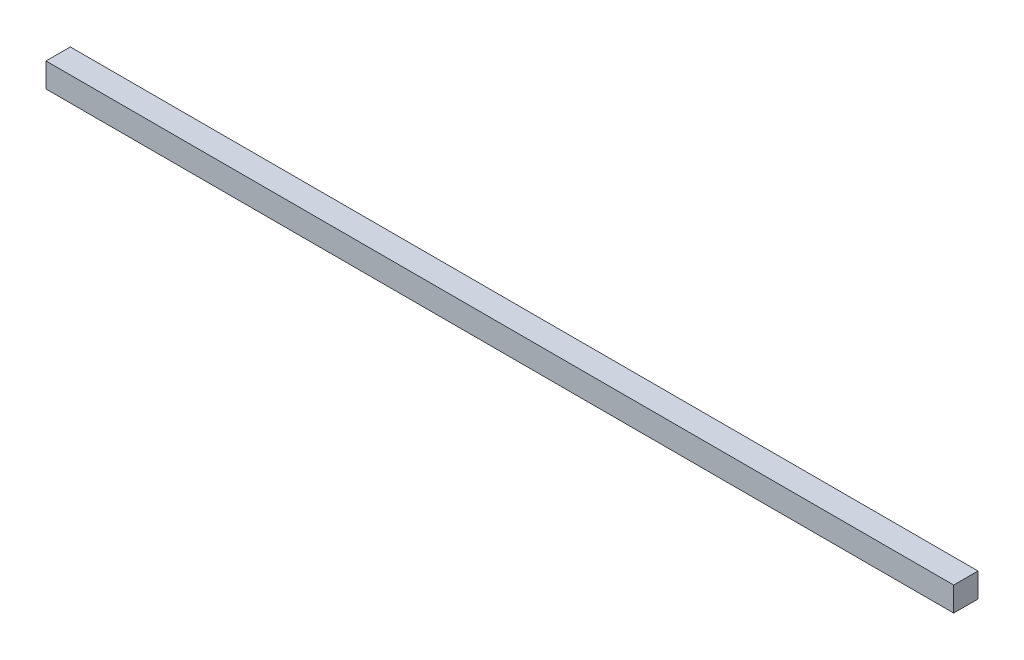
ISO-10303-21;
HEADER;
FILE_DESCRIPTION(('STEP AP214'),'2;1');
FILE_NAME('part.step','',(''),(''),'','','');
FILE_SCHEMA(('AUTOMOTIVE_DESIGN { 1 0 10303 214 1 1 1 1 }'));
ENDSEC;
DATA;
#1=APPLICATION_CONTEXT('core data for automotive mechanical design processes');
#2=APPLICATION_PROTOCOL_DEFINITION('international standard','automotive_design',2000,#1);
#3=PRODUCT_CONTEXT('',#1,'mechanical');
#4=PRODUCT('Part','Part','',(#3));
#5=PRODUCT_RELATED_PRODUCT_CATEGORY('part','',(#4));
#6=PRODUCT_DEFINITION_FORMATION('','',#4);
#7=PRODUCT_DEFINITION_CONTEXT('part definition',#1,'design');
#8=PRODUCT_DEFINITION('design','',#6,#7);
#9=PRODUCT_DEFINITION_SHAPE('','',#8);
#10=(LENGTH_UNIT() NAMED_UNIT(*) SI_UNIT(.MILLI.,.METRE.));
#11=(NAMED_UNIT(*) PLANE_ANGLE_UNIT() SI_UNIT($,.RADIAN.));
#12=(NAMED_UNIT(*) SI_UNIT($,.STERADIAN.) SOLID_ANGLE_UNIT());
#13=UNCERTAINTY_MEASURE_WITH_UNIT(LENGTH_MEASURE(1.E-05),#10,'distance_accuracy_value','');
#14=(GEOMETRIC_REPRESENTATION_CONTEXT(3) GLOBAL_UNCERTAINTY_ASSIGNED_CONTEXT((#13)) GLOBAL_UNIT_ASSIGNED_CONTEXT((#10,
#11,#12)) REPRESENTATION_CONTEXT('',''));
#15=CARTESIAN_POINT('',(0.,0.,0.));
#16=DIRECTION('',(0.,0.,1.));
#17=DIRECTION('',(1.,0.,0.));
#18=AXIS2_PLACEMENT_3D('',#15,#16,#17);
#19=CARTESIAN_POINT('',(1422.4,0.,0.));
#20=DIRECTION('',(0.,0.,-1.));
#21=DIRECTION('',(0.,1.,0.));
#22=AXIS2_PLACEMENT_3D('',#19,#20,#21);
#23=PLANE('',#22);
#24=DIRECTION('',(0.,-1.,0.));
#25=VECTOR('',#24,1.);
#26=CARTESIAN_POINT('',(0.,0.,0.));
#27=LINE('',#26,#25);
#28=CARTESIAN_POINT('',(0.,0.,0.));
#29=VERTEX_POINT('',#28);
#30=CARTESIAN_POINT('',(0.,-38.1,0.));
#31=VERTEX_POINT('',#30);
#32=EDGE_CURVE('E111',#29,#31,#27,.T.);
#33=ORIENTED_EDGE('',*,*,#32,.T.);
#34=DIRECTION('',(-1.,0.,0.));
#35=VECTOR('',#34,1.);
#36=CARTESIAN_POINT('',(1422.4,-38.1,0.));
#37=LINE('',#36,#35);
#38=CARTESIAN_POINT('',(1422.4,-38.1,0.));
#39=VERTEX_POINT('',#38);
#40=EDGE_CURVE('E11',#39,#31,#37,.T.);
#41=ORIENTED_EDGE('',*,*,#40,.F.);
#42=DIRECTION('',(0.,-1.,0.));
#43=VECTOR('',#42,1.);
#44=CARTESIAN_POINT('',(1422.4,0.,0.));
#45=LINE('',#44,#43);
#46=CARTESIAN_POINT('',(1422.4,0.,0.));
#47=VERTEX_POINT('',#46);
#48=EDGE_CURVE('E95',#47,#39,#45,.T.);
#49=ORIENTED_EDGE('',*,*,#48,.F.);
#50=DIRECTION('',(-1.,0.,0.));
#51=VECTOR('',#50,1.);
#52=CARTESIAN_POINT('',(1422.4,0.,0.));
#53=LINE('',#52,#51);
#54=EDGE_CURVE('E107',#47,#29,#53,.T.);
#55=ORIENTED_EDGE('',*,*,#54,.T.);
#56=EDGE_LOOP('',(#33,#41,#49,#55));
#57=FACE_BOUND('',#56,.T.);
#58=ADVANCED_FACE('F43',(#57),#23,.F.);
#59=CARTESIAN_POINT('',(1422.4,-38.1,0.));
#60=DIRECTION('',(0.,1.,0.));
#61=DIRECTION('',(0.,0.,1.));
#62=AXIS2_PLACEMENT_3D('',#59,#60,#61);
#63=PLANE('',#62);
#64=DIRECTION('',(0.,0.,-1.));
#65=VECTOR('',#64,1.);
#66=CARTESIAN_POINT('',(0.,-38.1,0.));
#67=LINE('',#66,#65);
#68=CARTESIAN_POINT('',(0.,-38.1,-38.1));
#69=VERTEX_POINT('',#68);
#70=EDGE_CURVE('E100',#31,#69,#67,.T.);
#71=ORIENTED_EDGE('',*,*,#70,.T.);
#72=DIRECTION('',(-1.,0.,0.));
#73=VECTOR('',#72,1.);
#74=CARTESIAN_POINT('',(1422.4,-38.1,-38.1));
#75=LINE('',#74,#73);
#76=CARTESIAN_POINT('',(1422.4,-38.1,-38.1));
#77=VERTEX_POINT('',#76);
#78=EDGE_CURVE('E52',#77,#69,#75,.T.);
#79=ORIENTED_EDGE('',*,*,#78,.F.);
#80=DIRECTION('',(0.,0.,-1.));
#81=VECTOR('',#80,1.);
#82=CARTESIAN_POINT('',(1422.4,-38.1,0.));
#83=LINE('',#82,#81);
#84=EDGE_CURVE('E90',#39,#77,#83,.T.);
#85=ORIENTED_EDGE('',*,*,#84,.F.);
#86=ORIENTED_EDGE('',*,*,#40,.T.);
#87=EDGE_LOOP('',(#71,#79,#85,#86));
#88=FACE_BOUND('',#87,.T.);
#89=ADVANCED_FACE('F99',(#88),#63,.F.);
#90=CARTESIAN_POINT('',(1422.4,0.,-38.1));
#91=DIRECTION('',(0.,0.,1.));
#92=DIRECTION('',(0.,-1.,0.));
#93=AXIS2_PLACEMENT_3D('',#90,#91,#92);
#94=PLANE('',#93);
#95=DIRECTION('',(0.,1.,0.));
#96=VECTOR('',#95,1.);
#97=CARTESIAN_POINT('',(0.,0.,-38.1));
#98=LINE('',#97,#96);
#99=CARTESIAN_POINT('',(0.,0.,-38.1));
#100=VERTEX_POINT('',#99);
#101=EDGE_CURVE('E77',#69,#100,#98,.T.);
#102=ORIENTED_EDGE('',*,*,#101,.T.);
#103=DIRECTION('',(-1.,0.,0.));
#104=VECTOR('',#103,1.);
#105=CARTESIAN_POINT('',(1422.4,0.,-38.1));
#106=LINE('',#105,#104);
#107=CARTESIAN_POINT('',(1422.4,0.,-38.1));
#108=VERTEX_POINT('',#107);
#109=EDGE_CURVE('E102',#108,#100,#106,.T.);
#110=ORIENTED_EDGE('',*,*,#109,.F.);
#111=DIRECTION('',(0.,1.,0.));
#112=VECTOR('',#111,1.);
#113=CARTESIAN_POINT('',(1422.4,0.,-38.1));
#114=LINE('',#113,#112);
#115=EDGE_CURVE('E93',#77,#108,#114,.T.);
#116=ORIENTED_EDGE('',*,*,#115,.F.);
#117=ORIENTED_EDGE('',*,*,#78,.T.);
#118=EDGE_LOOP('',(#102,#110,#116,#117));
#119=FACE_BOUND('',#118,.T.);
#120=ADVANCED_FACE('F103',(#119),#94,.F.);
#121=CARTESIAN_POINT('',(1422.4,0.,0.));
#122=DIRECTION('',(0.,-1.,0.));
#123=DIRECTION('',(0.,0.,-1.));
#124=AXIS2_PLACEMENT_3D('',#121,#122,#123);
#125=PLANE('',#124);
#126=DIRECTION('',(0.,0.,1.));
#127=VECTOR('',#126,1.);
#128=CARTESIAN_POINT('',(0.,0.,0.));
#129=LINE('',#128,#127);
#130=EDGE_CURVE('E83',#100,#29,#129,.T.);
#131=ORIENTED_EDGE('',*,*,#130,.T.);
#132=ORIENTED_EDGE('',*,*,#54,.F.);
#133=DIRECTION('',(0.,0.,1.));
#134=VECTOR('',#133,1.);
#135=CARTESIAN_POINT('',(1422.4,0.,0.));
#136=LINE('',#135,#134);
#137=EDGE_CURVE('E60',#108,#47,#136,.T.);
#138=ORIENTED_EDGE('',*,*,#137,.F.);
#139=ORIENTED_EDGE('',*,*,#109,.T.);
#140=EDGE_LOOP('',(#131,#132,#138,#139));
#141=FACE_BOUND('',#140,.T.);
#142=ADVANCED_FACE('F124',(#141),#125,.F.);
#143=CARTESIAN_POINT('',(1422.4,0.,0.));
#144=DIRECTION('',(1.,0.,0.));
#145=DIRECTION('',(0.,0.,-1.));
#146=AXIS2_PLACEMENT_3D('',#143,#144,#145);
#147=PLANE('',#146);
#148=ORIENTED_EDGE('',*,*,#48,.T.);
#149=ORIENTED_EDGE('',*,*,#84,.T.);
#150=ORIENTED_EDGE('',*,*,#115,.T.);
#151=ORIENTED_EDGE('',*,*,#137,.T.);
#152=EDGE_LOOP('',(#148,#149,#150,#151));
#153=FACE_BOUND('',#152,.T.);
#154=ADVANCED_FACE('F91',(#153),#147,.T.);
#155=CARTESIAN_POINT('',(0.,0.,0.));
#156=DIRECTION('',(1.,0.,0.));
#157=DIRECTION('',(0.,0.,-1.));
#158=AXIS2_PLACEMENT_3D('',#155,#156,#157);
#159=PLANE('',#158);
#160=ORIENTED_EDGE('',*,*,#32,.F.);
#161=ORIENTED_EDGE('',*,*,#130,.F.);
#162=ORIENTED_EDGE('',*,*,#101,.F.);
#163=ORIENTED_EDGE('',*,*,#70,.F.);
#164=EDGE_LOOP('',(#160,#161,#162,#163));
#165=FACE_BOUND('',#164,.T.);
#166=ADVANCED_FACE('F127',(#165),#159,.F.);
#167=CLOSED_SHELL('',(#58,#89,#120,#142,#154,#166));
#168=MANIFOLD_SOLID_BREP('B2',#167);
#169=ADVANCED_BREP_SHAPE_REPRESENTATION('',(#18,#168),#14);
#170=SHAPE_DEFINITION_REPRESENTATION(#9,#169);
ENDSEC;
END-ISO-10303-21;
